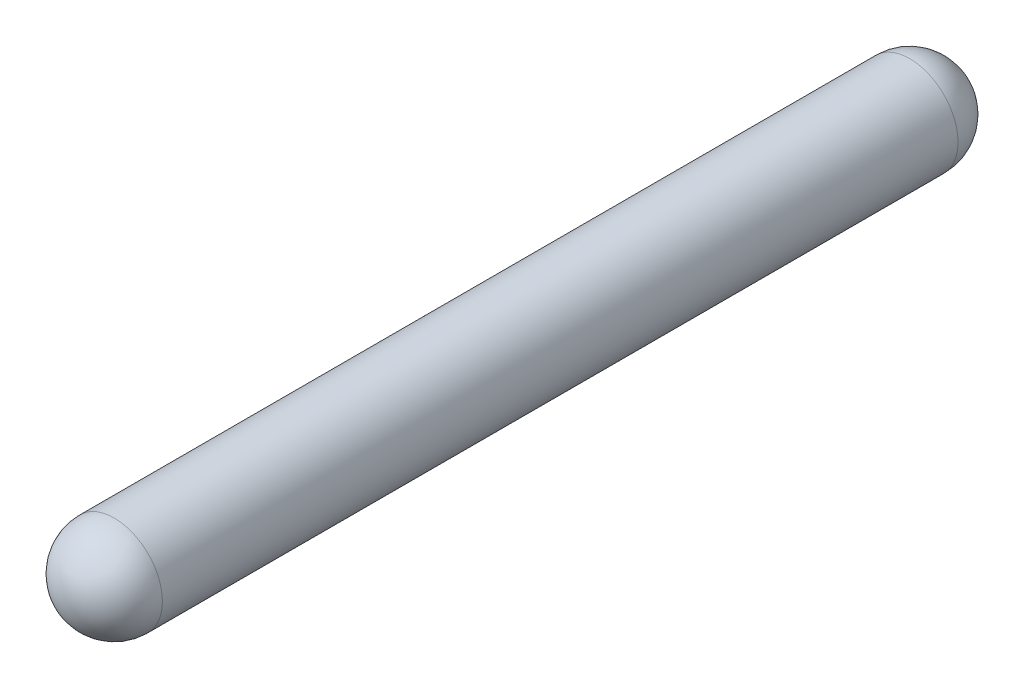
ISO-10303-21;
HEADER;
FILE_DESCRIPTION(('STEP AP214'),'2;1');
FILE_NAME('part.step','',(''),(''),'','','');
FILE_SCHEMA(('AUTOMOTIVE_DESIGN { 1 0 10303 214 1 1 1 1 }'));
ENDSEC;
DATA;
#1=APPLICATION_CONTEXT('core data for automotive mechanical design processes');
#2=APPLICATION_PROTOCOL_DEFINITION('international standard','automotive_design',2000,#1);
#3=PRODUCT_CONTEXT('',#1,'mechanical');
#4=PRODUCT('Part','Part','',(#3));
#5=PRODUCT_RELATED_PRODUCT_CATEGORY('part','',(#4));
#6=PRODUCT_DEFINITION_FORMATION('','',#4);
#7=PRODUCT_DEFINITION_CONTEXT('part definition',#1,'design');
#8=PRODUCT_DEFINITION('design','',#6,#7);
#9=PRODUCT_DEFINITION_SHAPE('','',#8);
#10=(LENGTH_UNIT() NAMED_UNIT(*) SI_UNIT(.MILLI.,.METRE.));
#11=(NAMED_UNIT(*) PLANE_ANGLE_UNIT() SI_UNIT($,.RADIAN.));
#12=(NAMED_UNIT(*) SI_UNIT($,.STERADIAN.) SOLID_ANGLE_UNIT());
#13=UNCERTAINTY_MEASURE_WITH_UNIT(LENGTH_MEASURE(1.E-05),#10,'distance_accuracy_value','');
#14=(GEOMETRIC_REPRESENTATION_CONTEXT(3) GLOBAL_UNCERTAINTY_ASSIGNED_CONTEXT((#13)) GLOBAL_UNIT_ASSIGNED_CONTEXT((#10,
#11,#12)) REPRESENTATION_CONTEXT('',''));
#15=CARTESIAN_POINT('',(0.,0.,0.));
#16=DIRECTION('',(0.,0.,1.));
#17=DIRECTION('',(1.,0.,0.));
#18=AXIS2_PLACEMENT_3D('',#15,#16,#17);
#19=CARTESIAN_POINT('',(0.,0.,16.5));
#20=DIRECTION('',(0.,0.,-1.));
#21=DIRECTION('',(1.,0.,0.));
#22=AXIS2_PLACEMENT_3D('',#19,#20,#21);
#23=SPHERICAL_SURFACE('',#22,2.);
#24=CARTESIAN_POINT('',(0.,0.,16.5));
#25=DIRECTION('',(0.,0.,-1.));
#26=DIRECTION('',(-1.,0.,0.));
#27=AXIS2_PLACEMENT_3D('',#24,#25,#26);
#28=CIRCLE('',#27,2.);
#29=CARTESIAN_POINT('',(-2.,0.,16.5));
#30=VERTEX_POINT('',#29);
#31=EDGE_CURVE('E43',#30,#30,#28,.T.);
#32=ORIENTED_EDGE('',*,*,#31,.F.);
#33=EDGE_LOOP('',(#32));
#34=FACE_BOUND('',#33,.T.);
#35=ADVANCED_FACE('F37',(#34),#23,.T.);
#36=CARTESIAN_POINT('',(0.,0.,-16.5));
#37=DIRECTION('',(0.,0.,-1.));
#38=DIRECTION('',(-1.,0.,0.));
#39=AXIS2_PLACEMENT_3D('',#36,#37,#38);
#40=SPHERICAL_SURFACE('',#39,2.);
#41=CARTESIAN_POINT('',(0.,0.,-16.5));
#42=DIRECTION('',(0.,0.,-1.));
#43=DIRECTION('',(-1.,0.,0.));
#44=AXIS2_PLACEMENT_3D('',#41,#42,#43);
#45=CIRCLE('',#44,2.);
#46=CARTESIAN_POINT('',(-2.,0.,-16.5));
#47=VERTEX_POINT('',#46);
#48=EDGE_CURVE('E10',#47,#47,#45,.T.);
#49=ORIENTED_EDGE('',*,*,#48,.T.);
#50=EDGE_LOOP('',(#49));
#51=FACE_BOUND('',#50,.T.);
#52=ADVANCED_FACE('F53',(#51),#40,.T.);
#53=CARTESIAN_POINT('',(0.,0.,18.5));
#54=DIRECTION('',(0.,0.,-1.));
#55=DIRECTION('',(-1.,0.,0.));
#56=AXIS2_PLACEMENT_3D('',#53,#54,#55);
#57=CYLINDRICAL_SURFACE('',#56,2.);
#58=ORIENTED_EDGE('',*,*,#31,.T.);
#59=EDGE_LOOP('',(#58));
#60=FACE_BOUND('',#59,.T.);
#61=ORIENTED_EDGE('',*,*,#48,.F.);
#62=EDGE_LOOP('',(#61));
#63=FACE_BOUND('',#62,.T.);
#64=ADVANCED_FACE('F49',(#60,#63),#57,.T.);
#65=CLOSED_SHELL('',(#35,#52,#64));
#66=MANIFOLD_SOLID_BREP('B2',#65);
#67=ADVANCED_BREP_SHAPE_REPRESENTATION('',(#18,#66),#14);
#68=SHAPE_DEFINITION_REPRESENTATION(#9,#67);
ENDSEC;
END-ISO-10303-21;
